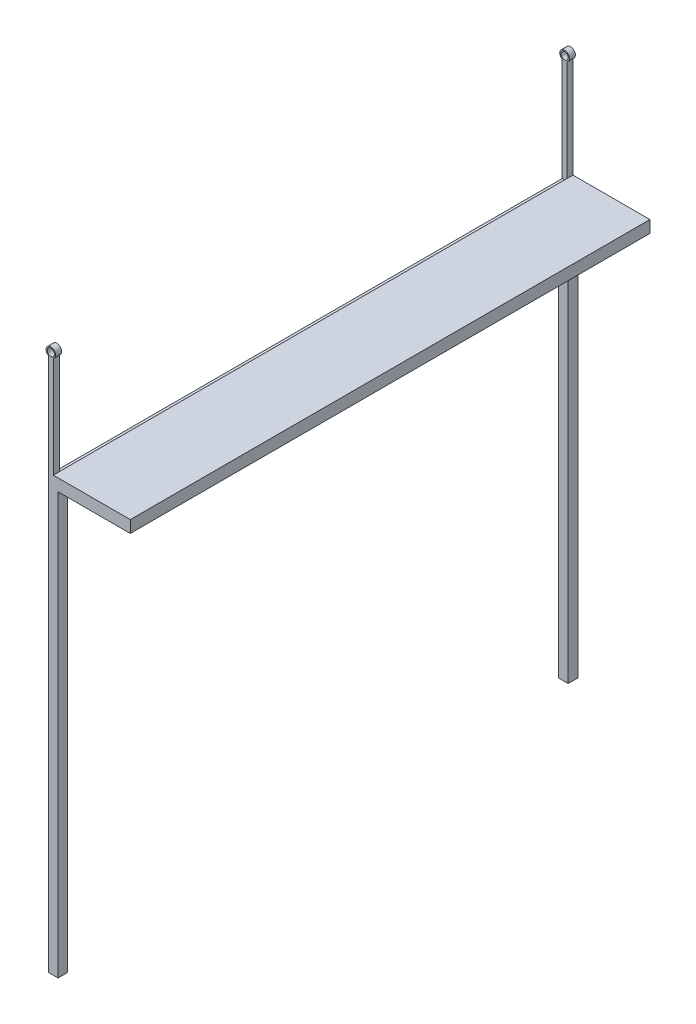
ISO-10303-21;
HEADER;
FILE_DESCRIPTION(('STEP AP214'),'2;1');
FILE_NAME('part.step','',(''),(''),'','','');
FILE_SCHEMA(('AUTOMOTIVE_DESIGN { 1 0 10303 214 1 1 1 1 }'));
ENDSEC;
DATA;
#1=APPLICATION_CONTEXT('core data for automotive mechanical design processes');
#2=APPLICATION_PROTOCOL_DEFINITION('international standard','automotive_design',2000,#1);
#3=PRODUCT_CONTEXT('',#1,'mechanical');
#4=PRODUCT('Part','Part','',(#3));
#5=PRODUCT_RELATED_PRODUCT_CATEGORY('part','',(#4));
#6=PRODUCT_DEFINITION_FORMATION('','',#4);
#7=PRODUCT_DEFINITION_CONTEXT('part definition',#1,'design');
#8=PRODUCT_DEFINITION('design','',#6,#7);
#9=PRODUCT_DEFINITION_SHAPE('','',#8);
#10=(LENGTH_UNIT() NAMED_UNIT(*) SI_UNIT(.MILLI.,.METRE.));
#11=(NAMED_UNIT(*) PLANE_ANGLE_UNIT() SI_UNIT($,.RADIAN.));
#12=(NAMED_UNIT(*) SI_UNIT($,.STERADIAN.) SOLID_ANGLE_UNIT());
#13=UNCERTAINTY_MEASURE_WITH_UNIT(LENGTH_MEASURE(1.E-05),#10,'distance_accuracy_value','');
#14=(GEOMETRIC_REPRESENTATION_CONTEXT(3) GLOBAL_UNCERTAINTY_ASSIGNED_CONTEXT((#13)) GLOBAL_UNIT_ASSIGNED_CONTEXT((#10,
#11,#12)) REPRESENTATION_CONTEXT('',''));
#15=CARTESIAN_POINT('',(0.,0.,0.));
#16=DIRECTION('',(0.,0.,1.));
#17=DIRECTION('',(1.,0.,0.));
#18=AXIS2_PLACEMENT_3D('',#15,#16,#17);
#19=CARTESIAN_POINT('',(0.,0.,0.));
#20=DIRECTION('',(0.,-1.,0.));
#21=DIRECTION('',(0.,0.,-1.));
#22=AXIS2_PLACEMENT_3D('',#19,#20,#21);
#23=PLANE('',#22);
#24=DIRECTION('',(-1.,0.,0.));
#25=VECTOR('',#24,1.);
#26=CARTESIAN_POINT('',(0.,0.,-1320.8));
#27=LINE('',#26,#25);
#28=CARTESIAN_POINT('',(50.8,0.,-1320.8));
#29=VERTEX_POINT('',#28);
#30=CARTESIAN_POINT('',(0.,0.,-1320.8));
#31=VERTEX_POINT('',#30);
#32=EDGE_CURVE('E182',#29,#31,#27,.T.);
#33=ORIENTED_EDGE('',*,*,#32,.F.);
#34=DIRECTION('',(0.,0.,1.));
#35=VECTOR('',#34,1.);
#36=CARTESIAN_POINT('',(50.8,0.,-1371.6));
#37=LINE('',#36,#35);
#38=CARTESIAN_POINT('',(50.8,0.,-1371.6));
#39=VERTEX_POINT('',#38);
#40=EDGE_CURVE('E184',#39,#29,#37,.T.);
#41=ORIENTED_EDGE('',*,*,#40,.F.);
#42=DIRECTION('',(-1.,0.,0.));
#43=VECTOR('',#42,1.);
#44=CARTESIAN_POINT('',(-25.4,0.,-1371.6));
#45=LINE('',#44,#43);
#46=CARTESIAN_POINT('',(431.8,0.,-1371.6));
#47=VERTEX_POINT('',#46);
#48=EDGE_CURVE('E294',#47,#39,#45,.T.);
#49=ORIENTED_EDGE('',*,*,#48,.F.);
#50=DIRECTION('',(0.,0.,-1.));
#51=VECTOR('',#50,1.);
#52=CARTESIAN_POINT('',(431.8,0.,1371.6));
#53=LINE('',#52,#51);
#54=CARTESIAN_POINT('',(431.8,0.,1371.6));
#55=VERTEX_POINT('',#54);
#56=EDGE_CURVE('E226',#55,#47,#53,.T.);
#57=ORIENTED_EDGE('',*,*,#56,.F.);
#58=DIRECTION('',(1.,0.,0.));
#59=VECTOR('',#58,1.);
#60=CARTESIAN_POINT('',(-25.4,0.,1371.6));
#61=LINE('',#60,#59);
#62=CARTESIAN_POINT('',(50.8,0.,1371.6));
#63=VERTEX_POINT('',#62);
#64=EDGE_CURVE('E59',#63,#55,#61,.T.);
#65=ORIENTED_EDGE('',*,*,#64,.F.);
#66=DIRECTION('',(0.,0.,1.));
#67=VECTOR('',#66,1.);
#68=CARTESIAN_POINT('',(50.8,0.,1371.6));
#69=LINE('',#68,#67);
#70=CARTESIAN_POINT('',(50.8,0.,1320.8));
#71=VERTEX_POINT('',#70);
#72=EDGE_CURVE('E200',#71,#63,#69,.T.);
#73=ORIENTED_EDGE('',*,*,#72,.F.);
#74=DIRECTION('',(1.,0.,0.));
#75=VECTOR('',#74,1.);
#76=CARTESIAN_POINT('',(0.,0.,1320.8));
#77=LINE('',#76,#75);
#78=CARTESIAN_POINT('',(0.,0.,1320.8));
#79=VERTEX_POINT('',#78);
#80=EDGE_CURVE('E195',#79,#71,#77,.T.);
#81=ORIENTED_EDGE('',*,*,#80,.F.);
#82=DIRECTION('',(0.,0.,1.));
#83=VECTOR('',#82,1.);
#84=CARTESIAN_POINT('',(0.,0.,-1371.6));
#85=LINE('',#84,#83);
#86=EDGE_CURVE('E220',#31,#79,#85,.T.);
#87=ORIENTED_EDGE('',*,*,#86,.F.);
#88=EDGE_LOOP('',(#33,#41,#49,#57,#65,#73,#81,#87));
#89=FACE_BOUND('',#88,.T.);
#90=ADVANCED_FACE('F36',(#89),#23,.T.);
#91=CARTESIAN_POINT('',(0.,50.8,0.));
#92=DIRECTION('',(0.,-1.,0.));
#93=DIRECTION('',(0.,0.,-1.));
#94=AXIS2_PLACEMENT_3D('',#91,#92,#93);
#95=PLANE('',#94);
#96=DIRECTION('',(-1.,0.,0.));
#97=VECTOR('',#96,1.);
#98=CARTESIAN_POINT('',(0.,50.8,-1339.85));
#99=LINE('',#98,#97);
#100=CARTESIAN_POINT('',(25.4,50.8,-1339.85));
#101=VERTEX_POINT('',#100);
#102=CARTESIAN_POINT('',(0.,50.8,-1339.85));
#103=VERTEX_POINT('',#102);
#104=EDGE_CURVE('E248',#101,#103,#99,.T.);
#105=ORIENTED_EDGE('',*,*,#104,.T.);
#106=DIRECTION('',(0.,0.,1.));
#107=VECTOR('',#106,1.);
#108=CARTESIAN_POINT('',(0.,50.8,-1371.6));
#109=LINE('',#108,#107);
#110=CARTESIAN_POINT('',(0.,50.8,1339.85));
#111=VERTEX_POINT('',#110);
#112=EDGE_CURVE('E219',#103,#111,#109,.T.);
#113=ORIENTED_EDGE('',*,*,#112,.T.);
#114=DIRECTION('',(-1.,0.,0.));
#115=VECTOR('',#114,1.);
#116=CARTESIAN_POINT('',(0.,50.8,1339.85));
#117=LINE('',#116,#115);
#118=CARTESIAN_POINT('',(25.4000000000003,50.8,1339.85));
#119=VERTEX_POINT('',#118);
#120=EDGE_CURVE('E278',#119,#111,#117,.T.);
#121=ORIENTED_EDGE('',*,*,#120,.F.);
#122=DIRECTION('',(0.,0.,1.));
#123=VECTOR('',#122,1.);
#124=CARTESIAN_POINT('',(25.4,50.8,-1371.6));
#125=LINE('',#124,#123);
#126=EDGE_CURVE('E235',#101,#119,#125,.T.);
#127=ORIENTED_EDGE('',*,*,#126,.F.);
#128=EDGE_LOOP('',(#105,#113,#121,#127));
#129=FACE_BOUND('',#128,.T.);
#130=ADVANCED_FACE('F331',(#129),#95,.F.);
#131=CARTESIAN_POINT('',(25.4,50.8,1371.6));
#132=DIRECTION('',(-1.,0.,0.));
#133=DIRECTION('',(0.,0.,1.));
#134=AXIS2_PLACEMENT_3D('',#131,#132,#133);
#135=PLANE('',#134);
#136=DIRECTION('',(0.,1.,0.));
#137=VECTOR('',#136,1.);
#138=CARTESIAN_POINT('',(25.4,0.,-1339.85));
#139=LINE('',#138,#137);
#140=CARTESIAN_POINT('',(25.4,63.5,-1339.85));
#141=VERTEX_POINT('',#140);
#142=CARTESIAN_POINT('',(25.4,596.9,-1339.85));
#143=VERTEX_POINT('',#142);
#144=EDGE_CURVE('E249',#141,#143,#139,.T.);
#145=ORIENTED_EDGE('',*,*,#144,.F.);
#146=DIRECTION('',(0.,0.,1.));
#147=VECTOR('',#146,1.);
#148=CARTESIAN_POINT('',(25.4,63.5,-1371.6));
#149=LINE('',#148,#147);
#150=CARTESIAN_POINT('',(25.4,63.5,-1371.6));
#151=VERTEX_POINT('',#150);
#152=EDGE_CURVE('E236',#151,#141,#149,.T.);
#153=ORIENTED_EDGE('',*,*,#152,.F.);
#154=DIRECTION('',(0.,-1.,0.));
#155=VECTOR('',#154,1.);
#156=CARTESIAN_POINT('',(25.4,50.8,-1371.6));
#157=LINE('',#156,#155);
#158=CARTESIAN_POINT('',(25.4,596.9,-1371.6));
#159=VERTEX_POINT('',#158);
#160=EDGE_CURVE('E11',#159,#151,#157,.T.);
#161=ORIENTED_EDGE('',*,*,#160,.F.);
#162=DIRECTION('',(0.,0.,-1.));
#163=VECTOR('',#162,1.);
#164=CARTESIAN_POINT('',(25.4,596.9,-1339.85));
#165=LINE('',#164,#163);
#166=EDGE_CURVE('E264',#143,#159,#165,.T.);
#167=ORIENTED_EDGE('',*,*,#166,.F.);
#168=EDGE_LOOP('',(#145,#153,#161,#167));
#169=FACE_BOUND('',#168,.T.);
#170=ADVANCED_FACE('F38',(#169),#135,.F.);
#171=DIRECTION('',(0.,-1.,0.));
#172=VECTOR('',#171,1.);
#173=CARTESIAN_POINT('',(25.4,50.8,1371.6));
#174=LINE('',#173,#172);
#175=CARTESIAN_POINT('',(25.4,596.9,1371.6));
#176=VERTEX_POINT('',#175);
#177=CARTESIAN_POINT('',(25.4000000000003,63.5,1371.6));
#178=VERTEX_POINT('',#177);
#179=EDGE_CURVE('E44',#176,#178,#174,.T.);
#180=ORIENTED_EDGE('',*,*,#179,.T.);
#181=CARTESIAN_POINT('',(25.4000000000003,63.5,1339.85));
#182=VERTEX_POINT('',#181);
#183=EDGE_CURVE('E241',#182,#178,#149,.T.);
#184=ORIENTED_EDGE('',*,*,#183,.F.);
#185=DIRECTION('',(0.,1.,0.));
#186=VECTOR('',#185,1.);
#187=CARTESIAN_POINT('',(25.4,0.,1339.85));
#188=LINE('',#187,#186);
#189=CARTESIAN_POINT('',(25.4,596.9,1339.85));
#190=VERTEX_POINT('',#189);
#191=EDGE_CURVE('E272',#182,#190,#188,.T.);
#192=ORIENTED_EDGE('',*,*,#191,.T.);
#193=DIRECTION('',(0.,0.,1.));
#194=VECTOR('',#193,1.);
#195=CARTESIAN_POINT('',(25.4,596.9,1339.85));
#196=LINE('',#195,#194);
#197=EDGE_CURVE('E284',#190,#176,#196,.T.);
#198=ORIENTED_EDGE('',*,*,#197,.T.);
#199=EDGE_LOOP('',(#180,#184,#192,#198));
#200=FACE_BOUND('',#199,.T.);
#201=ADVANCED_FACE('F301',(#200),#135,.F.);
#202=CARTESIAN_POINT('',(-25.4,50.8,-1371.6));
#203=DIRECTION('',(0.,0.,1.));
#204=DIRECTION('',(1.,0.,0.));
#205=AXIS2_PLACEMENT_3D('',#202,#203,#204);
#206=PLANE('',#205);
#207=ORIENTED_EDGE('',*,*,#48,.T.);
#208=DIRECTION('',(0.,1.,0.));
#209=VECTOR('',#208,1.);
#210=CARTESIAN_POINT('',(50.8,-2222.5,-1371.6));
#211=LINE('',#210,#209);
#212=CARTESIAN_POINT('',(50.8,-2222.5,-1371.6));
#213=VERTEX_POINT('',#212);
#214=EDGE_CURVE('E174',#213,#39,#211,.T.);
#215=ORIENTED_EDGE('',*,*,#214,.F.);
#216=DIRECTION('',(1.,0.,0.));
#217=VECTOR('',#216,1.);
#218=CARTESIAN_POINT('',(0.,-2222.5,-1371.6));
#219=LINE('',#218,#217);
#220=CARTESIAN_POINT('',(0.,-2222.5,-1371.6));
#221=VERTEX_POINT('',#220);
#222=EDGE_CURVE('E170',#221,#213,#219,.T.);
#223=ORIENTED_EDGE('',*,*,#222,.F.);
#224=DIRECTION('',(0.,-1.,0.));
#225=VECTOR('',#224,1.);
#226=CARTESIAN_POINT('',(0.,0.,-1371.6));
#227=LINE('',#226,#225);
#228=CARTESIAN_POINT('',(0.,596.9,-1371.6));
#229=VERTEX_POINT('',#228);
#230=EDGE_CURVE('E155',#229,#221,#227,.T.);
#231=ORIENTED_EDGE('',*,*,#230,.F.);
#232=CARTESIAN_POINT('',(12.7,618.897045256125,-1371.6));
#233=DIRECTION('',(0.,0.,1.));
#234=DIRECTION('',(1.,0.,0.));
#235=AXIS2_PLACEMENT_3D('',#232,#233,#234);
#236=CIRCLE('',#235,25.4);
#237=EDGE_CURVE('E166',#159,#229,#236,.T.);
#238=ORIENTED_EDGE('',*,*,#237,.F.);
#239=ORIENTED_EDGE('',*,*,#160,.T.);
#240=DIRECTION('',(-1.,0.,0.));
#241=VECTOR('',#240,1.);
#242=CARTESIAN_POINT('',(25.4,63.5,-1371.6));
#243=LINE('',#242,#241);
#244=CARTESIAN_POINT('',(431.8,63.5,-1371.6));
#245=VERTEX_POINT('',#244);
#246=EDGE_CURVE('E167',#245,#151,#243,.T.);
#247=ORIENTED_EDGE('',*,*,#246,.F.);
#248=DIRECTION('',(0.,1.,0.));
#249=VECTOR('',#248,1.);
#250=CARTESIAN_POINT('',(431.8,0.,-1371.6));
#251=LINE('',#250,#249);
#252=EDGE_CURVE('E229',#47,#245,#251,.T.);
#253=ORIENTED_EDGE('',*,*,#252,.F.);
#254=EDGE_LOOP('',(#207,#215,#223,#231,#238,#239,#247,#253));
#255=FACE_BOUND('',#254,.T.);
#256=CARTESIAN_POINT('',(12.7,618.897045256125,-1371.6));
#257=DIRECTION('',(0.,0.,1.));
#258=DIRECTION('',(1.,0.,0.));
#259=AXIS2_PLACEMENT_3D('',#256,#257,#258);
#260=CIRCLE('',#259,19.05);
#261=CARTESIAN_POINT('',(31.7499999999999,618.897045256125,-1371.6));
#262=VERTEX_POINT('',#261);
#263=EDGE_CURVE('E261',#262,#262,#260,.T.);
#264=ORIENTED_EDGE('',*,*,#263,.T.);
#265=EDGE_LOOP('',(#264));
#266=FACE_BOUND('',#265,.T.);
#267=ADVANCED_FACE('F172',(#255,#266),#206,.F.);
#268=CARTESIAN_POINT('',(-25.4,50.8,1371.6));
#269=DIRECTION('',(0.,0.,-1.));
#270=DIRECTION('',(-1.,0.,0.));
#271=AXIS2_PLACEMENT_3D('',#268,#269,#270);
#272=PLANE('',#271);
#273=DIRECTION('',(0.,-1.,0.));
#274=VECTOR('',#273,1.);
#275=CARTESIAN_POINT('',(0.,0.,1371.6));
#276=LINE('',#275,#274);
#277=CARTESIAN_POINT('',(0.,596.9,1371.6));
#278=VERTEX_POINT('',#277);
#279=CARTESIAN_POINT('',(0.,-2222.5,1371.6));
#280=VERTEX_POINT('',#279);
#281=EDGE_CURVE('E287',#278,#280,#276,.T.);
#282=ORIENTED_EDGE('',*,*,#281,.T.);
#283=DIRECTION('',(-1.,0.,0.));
#284=VECTOR('',#283,1.);
#285=CARTESIAN_POINT('',(0.,-2222.5,1371.6));
#286=LINE('',#285,#284);
#287=CARTESIAN_POINT('',(50.8,-2222.5,1371.6));
#288=VERTEX_POINT('',#287);
#289=EDGE_CURVE('E204',#288,#280,#286,.T.);
#290=ORIENTED_EDGE('',*,*,#289,.F.);
#291=DIRECTION('',(0.,1.,0.));
#292=VECTOR('',#291,1.);
#293=CARTESIAN_POINT('',(50.8,-2222.5,1371.6));
#294=LINE('',#293,#292);
#295=EDGE_CURVE('E207',#288,#63,#294,.T.);
#296=ORIENTED_EDGE('',*,*,#295,.T.);
#297=ORIENTED_EDGE('',*,*,#64,.T.);
#298=DIRECTION('',(0.,-1.,0.));
#299=VECTOR('',#298,1.);
#300=CARTESIAN_POINT('',(431.8,0.,1371.6));
#301=LINE('',#300,#299);
#302=CARTESIAN_POINT('',(431.8,63.5,1371.6));
#303=VERTEX_POINT('',#302);
#304=EDGE_CURVE('E222',#303,#55,#301,.T.);
#305=ORIENTED_EDGE('',*,*,#304,.F.);
#306=DIRECTION('',(1.,0.,0.));
#307=VECTOR('',#306,1.);
#308=CARTESIAN_POINT('',(25.4000000000003,63.5,1371.6));
#309=LINE('',#308,#307);
#310=EDGE_CURVE('E239',#178,#303,#309,.T.);
#311=ORIENTED_EDGE('',*,*,#310,.F.);
#312=ORIENTED_EDGE('',*,*,#179,.F.);
#313=CARTESIAN_POINT('',(12.7,618.897045256125,1371.6));
#314=DIRECTION('',(0.,0.,1.));
#315=DIRECTION('',(1.,0.,0.));
#316=AXIS2_PLACEMENT_3D('',#313,#314,#315);
#317=CIRCLE('',#316,25.4);
#318=EDGE_CURVE('E267',#176,#278,#317,.T.);
#319=ORIENTED_EDGE('',*,*,#318,.T.);
#320=EDGE_LOOP('',(#282,#290,#296,#297,#305,#311,#312,#319));
#321=FACE_BOUND('',#320,.T.);
#322=CARTESIAN_POINT('',(12.7,618.897045256125,1371.6));
#323=DIRECTION('',(0.,0.,1.));
#324=DIRECTION('',(1.,0.,0.));
#325=AXIS2_PLACEMENT_3D('',#322,#323,#324);
#326=CIRCLE('',#325,19.05);
#327=CARTESIAN_POINT('',(31.7499999999999,618.897045256125,1371.6));
#328=VERTEX_POINT('',#327);
#329=EDGE_CURVE('E289',#328,#328,#326,.T.);
#330=ORIENTED_EDGE('',*,*,#329,.F.);
#331=EDGE_LOOP('',(#330));
#332=FACE_BOUND('',#331,.T.);
#333=ADVANCED_FACE('F307',(#321,#332),#272,.F.);
#334=CARTESIAN_POINT('',(0.,0.,1339.85));
#335=DIRECTION('',(-1.,0.,0.));
#336=DIRECTION('',(0.,0.,1.));
#337=AXIS2_PLACEMENT_3D('',#334,#335,#336);
#338=PLANE('',#337);
#339=ORIENTED_EDGE('',*,*,#281,.F.);
#340=DIRECTION('',(0.,0.,1.));
#341=VECTOR('',#340,1.);
#342=CARTESIAN_POINT('',(0.,596.9,1339.85));
#343=LINE('',#342,#341);
#344=CARTESIAN_POINT('',(0.,596.9,1339.85));
#345=VERTEX_POINT('',#344);
#346=EDGE_CURVE('E292',#345,#278,#343,.T.);
#347=ORIENTED_EDGE('',*,*,#346,.F.);
#348=DIRECTION('',(0.,-1.,0.));
#349=VECTOR('',#348,1.);
#350=CARTESIAN_POINT('',(0.,0.,1339.85));
#351=LINE('',#350,#349);
#352=EDGE_CURVE('E275',#345,#111,#351,.T.);
#353=ORIENTED_EDGE('',*,*,#352,.T.);
#354=ORIENTED_EDGE('',*,*,#112,.F.);
#355=DIRECTION('',(0.,-1.,0.));
#356=VECTOR('',#355,1.);
#357=CARTESIAN_POINT('',(0.,0.,-1339.85));
#358=LINE('',#357,#356);
#359=CARTESIAN_POINT('',(0.,596.9,-1339.85));
#360=VERTEX_POINT('',#359);
#361=EDGE_CURVE('E252',#360,#103,#358,.T.);
#362=ORIENTED_EDGE('',*,*,#361,.F.);
#363=DIRECTION('',(0.,0.,-1.));
#364=VECTOR('',#363,1.);
#365=CARTESIAN_POINT('',(0.,596.9,-1339.85));
#366=LINE('',#365,#364);
#367=EDGE_CURVE('E163',#360,#229,#366,.T.);
#368=ORIENTED_EDGE('',*,*,#367,.T.);
#369=ORIENTED_EDGE('',*,*,#230,.T.);
#370=DIRECTION('',(0.,0.,-1.));
#371=VECTOR('',#370,1.);
#372=CARTESIAN_POINT('',(0.,-2222.5,-1371.6));
#373=LINE('',#372,#371);
#374=CARTESIAN_POINT('',(0.,-2222.5,-1320.8));
#375=VERTEX_POINT('',#374);
#376=EDGE_CURVE('E160',#375,#221,#373,.T.);
#377=ORIENTED_EDGE('',*,*,#376,.F.);
#378=DIRECTION('',(0.,1.,0.));
#379=VECTOR('',#378,1.);
#380=CARTESIAN_POINT('',(0.,-2222.5,-1320.8));
#381=LINE('',#380,#379);
#382=EDGE_CURVE('E51',#375,#31,#381,.T.);
#383=ORIENTED_EDGE('',*,*,#382,.T.);
#384=ORIENTED_EDGE('',*,*,#86,.T.);
#385=DIRECTION('',(0.,1.,0.));
#386=VECTOR('',#385,1.);
#387=CARTESIAN_POINT('',(0.,-2222.5,1320.8));
#388=LINE('',#387,#386);
#389=CARTESIAN_POINT('',(0.,-2222.5,1320.8));
#390=VERTEX_POINT('',#389);
#391=EDGE_CURVE('E216',#390,#79,#388,.T.);
#392=ORIENTED_EDGE('',*,*,#391,.F.);
#393=DIRECTION('',(0.,0.,-1.));
#394=VECTOR('',#393,1.);
#395=CARTESIAN_POINT('',(0.,-2222.5,1371.6));
#396=LINE('',#395,#394);
#397=EDGE_CURVE('E196',#280,#390,#396,.T.);
#398=ORIENTED_EDGE('',*,*,#397,.F.);
#399=EDGE_LOOP('',(#339,#347,#353,#354,#362,#368,#369,#377,#383,#384,#392,#398));
#400=FACE_BOUND('',#399,.T.);
#401=ADVANCED_FACE('F158',(#400),#338,.T.);
#402=CARTESIAN_POINT('',(12.7,618.897045256125,1339.85));
#403=DIRECTION('',(0.,0.,1.));
#404=DIRECTION('',(1.,0.,0.));
#405=AXIS2_PLACEMENT_3D('',#402,#403,#404);
#406=CYLINDRICAL_SURFACE('',#405,25.4);
#407=ORIENTED_EDGE('',*,*,#318,.F.);
#408=ORIENTED_EDGE('',*,*,#197,.F.);
#409=CARTESIAN_POINT('',(12.7,618.897045256125,1339.85));
#410=DIRECTION('',(0.,0.,1.));
#411=DIRECTION('',(1.,0.,0.));
#412=AXIS2_PLACEMENT_3D('',#409,#410,#411);
#413=CIRCLE('',#412,25.4);
#414=EDGE_CURVE('E271',#190,#345,#413,.T.);
#415=ORIENTED_EDGE('',*,*,#414,.T.);
#416=ORIENTED_EDGE('',*,*,#346,.T.);
#417=EDGE_LOOP('',(#407,#408,#415,#416));
#418=FACE_BOUND('',#417,.T.);
#419=ADVANCED_FACE('F339',(#418),#406,.T.);
#420=CARTESIAN_POINT('',(12.7,618.897045256125,1339.85));
#421=DIRECTION('',(0.,0.,1.));
#422=DIRECTION('',(1.,0.,0.));
#423=AXIS2_PLACEMENT_3D('',#420,#421,#422);
#424=CYLINDRICAL_SURFACE('',#423,19.05);
#425=CARTESIAN_POINT('',(12.7,618.897045256125,1339.85));
#426=DIRECTION('',(0.,0.,1.));
#427=DIRECTION('',(1.,0.,0.));
#428=AXIS2_PLACEMENT_3D('',#425,#426,#427);
#429=CIRCLE('',#428,19.05);
#430=CARTESIAN_POINT('',(31.7499999999999,618.897045256125,1339.85));
#431=VERTEX_POINT('',#430);
#432=EDGE_CURVE('E281',#431,#431,#429,.T.);
#433=ORIENTED_EDGE('',*,*,#432,.F.);
#434=EDGE_LOOP('',(#433));
#435=FACE_BOUND('',#434,.T.);
#436=ORIENTED_EDGE('',*,*,#329,.T.);
#437=EDGE_LOOP('',(#436));
#438=FACE_BOUND('',#437,.T.);
#439=ADVANCED_FACE('F408',(#435,#438),#424,.F.);
#440=CARTESIAN_POINT('',(0.,0.,1339.85));
#441=DIRECTION('',(0.,0.,1.));
#442=DIRECTION('',(1.,0.,0.));
#443=AXIS2_PLACEMENT_3D('',#440,#441,#442);
#444=PLANE('',#443);
#445=EDGE_CURVE('E269',#119,#182,#188,.T.);
#446=ORIENTED_EDGE('',*,*,#445,.F.);
#447=ORIENTED_EDGE('',*,*,#120,.T.);
#448=ORIENTED_EDGE('',*,*,#352,.F.);
#449=ORIENTED_EDGE('',*,*,#414,.F.);
#450=ORIENTED_EDGE('',*,*,#191,.F.);
#451=EDGE_LOOP('',(#446,#447,#448,#449,#450));
#452=FACE_BOUND('',#451,.T.);
#453=ORIENTED_EDGE('',*,*,#432,.T.);
#454=EDGE_LOOP('',(#453));
#455=FACE_BOUND('',#454,.T.);
#456=ADVANCED_FACE('F335',(#452,#455),#444,.F.);
#457=CARTESIAN_POINT('',(12.7,618.897045256125,-1339.85));
#458=DIRECTION('',(0.,0.,-1.));
#459=DIRECTION('',(-1.,0.,0.));
#460=AXIS2_PLACEMENT_3D('',#457,#458,#459);
#461=CYLINDRICAL_SURFACE('',#460,25.4);
#462=ORIENTED_EDGE('',*,*,#237,.T.);
#463=ORIENTED_EDGE('',*,*,#367,.F.);
#464=CARTESIAN_POINT('',(12.7,618.897045256125,-1339.85));
#465=DIRECTION('',(0.,0.,1.));
#466=DIRECTION('',(1.,0.,0.));
#467=AXIS2_PLACEMENT_3D('',#464,#465,#466);
#468=CIRCLE('',#467,25.4);
#469=EDGE_CURVE('E255',#143,#360,#468,.T.);
#470=ORIENTED_EDGE('',*,*,#469,.F.);
#471=ORIENTED_EDGE('',*,*,#166,.T.);
#472=EDGE_LOOP('',(#462,#463,#470,#471));
#473=FACE_BOUND('',#472,.T.);
#474=ADVANCED_FACE('F407',(#473),#461,.T.);
#475=CARTESIAN_POINT('',(12.7,618.897045256125,-1339.85));
#476=DIRECTION('',(0.,0.,-1.));
#477=DIRECTION('',(-1.,0.,0.));
#478=AXIS2_PLACEMENT_3D('',#475,#476,#477);
#479=CYLINDRICAL_SURFACE('',#478,19.05);
#480=CARTESIAN_POINT('',(12.7,618.897045256125,-1339.85));
#481=DIRECTION('',(0.,0.,1.));
#482=DIRECTION('',(1.,0.,0.));
#483=AXIS2_PLACEMENT_3D('',#480,#481,#482);
#484=CIRCLE('',#483,19.05);
#485=CARTESIAN_POINT('',(31.7499999999999,618.897045256125,-1339.85));
#486=VERTEX_POINT('',#485);
#487=EDGE_CURVE('E257',#486,#486,#484,.T.);
#488=ORIENTED_EDGE('',*,*,#487,.T.);
#489=EDGE_LOOP('',(#488));
#490=FACE_BOUND('',#489,.T.);
#491=ORIENTED_EDGE('',*,*,#263,.F.);
#492=EDGE_LOOP('',(#491));
#493=FACE_BOUND('',#492,.T.);
#494=ADVANCED_FACE('F420',(#490,#493),#479,.F.);
#495=CARTESIAN_POINT('',(0.,0.,-1339.85));
#496=DIRECTION('',(0.,0.,-1.));
#497=DIRECTION('',(1.,0.,0.));
#498=AXIS2_PLACEMENT_3D('',#495,#496,#497);
#499=PLANE('',#498);
#500=EDGE_CURVE('E245',#101,#141,#139,.T.);
#501=ORIENTED_EDGE('',*,*,#500,.T.);
#502=ORIENTED_EDGE('',*,*,#144,.T.);
#503=ORIENTED_EDGE('',*,*,#469,.T.);
#504=ORIENTED_EDGE('',*,*,#361,.T.);
#505=ORIENTED_EDGE('',*,*,#104,.F.);
#506=EDGE_LOOP('',(#501,#502,#503,#504,#505));
#507=FACE_BOUND('',#506,.T.);
#508=ORIENTED_EDGE('',*,*,#487,.F.);
#509=EDGE_LOOP('',(#508));
#510=FACE_BOUND('',#509,.T.);
#511=ADVANCED_FACE('F324',(#507,#510),#499,.F.);
#512=CARTESIAN_POINT('',(25.4,63.5,-1371.6));
#513=DIRECTION('',(1.,0.,0.));
#514=DIRECTION('',(0.,0.,-1.));
#515=AXIS2_PLACEMENT_3D('',#512,#513,#514);
#516=PLANE('',#515);
#517=ORIENTED_EDGE('',*,*,#126,.T.);
#518=ORIENTED_EDGE('',*,*,#445,.T.);
#519=EDGE_CURVE('E240',#141,#182,#149,.T.);
#520=ORIENTED_EDGE('',*,*,#519,.F.);
#521=ORIENTED_EDGE('',*,*,#500,.F.);
#522=EDGE_LOOP('',(#517,#518,#520,#521));
#523=FACE_BOUND('',#522,.T.);
#524=ADVANCED_FACE('F328',(#523),#516,.F.);
#525=CARTESIAN_POINT('',(0.,63.5,0.));
#526=DIRECTION('',(0.,1.,0.));
#527=DIRECTION('',(0.,0.,1.));
#528=AXIS2_PLACEMENT_3D('',#525,#526,#527);
#529=PLANE('',#528);
#530=ORIENTED_EDGE('',*,*,#152,.T.);
#531=ORIENTED_EDGE('',*,*,#519,.T.);
#532=ORIENTED_EDGE('',*,*,#183,.T.);
#533=ORIENTED_EDGE('',*,*,#310,.T.);
#534=DIRECTION('',(0.,0.,1.));
#535=VECTOR('',#534,1.);
#536=CARTESIAN_POINT('',(431.8,63.5,1371.6));
#537=LINE('',#536,#535);
#538=EDGE_CURVE('E232',#245,#303,#537,.T.);
#539=ORIENTED_EDGE('',*,*,#538,.F.);
#540=ORIENTED_EDGE('',*,*,#246,.T.);
#541=EDGE_LOOP('',(#530,#531,#532,#533,#539,#540));
#542=FACE_BOUND('',#541,.T.);
#543=ADVANCED_FACE('F312',(#542),#529,.T.);
#544=CARTESIAN_POINT('',(431.8,0.,0.));
#545=DIRECTION('',(-1.,0.,0.));
#546=DIRECTION('',(0.,0.,1.));
#547=AXIS2_PLACEMENT_3D('',#544,#545,#546);
#548=PLANE('',#547);
#549=ORIENTED_EDGE('',*,*,#304,.T.);
#550=ORIENTED_EDGE('',*,*,#56,.T.);
#551=ORIENTED_EDGE('',*,*,#252,.T.);
#552=ORIENTED_EDGE('',*,*,#538,.T.);
#553=EDGE_LOOP('',(#549,#550,#551,#552));
#554=FACE_BOUND('',#553,.T.);
#555=ADVANCED_FACE('F315',(#554),#548,.F.);
#556=CARTESIAN_POINT('',(0.,-2222.5,1320.8));
#557=DIRECTION('',(0.,0.,1.));
#558=DIRECTION('',(1.,0.,0.));
#559=AXIS2_PLACEMENT_3D('',#556,#557,#558);
#560=PLANE('',#559);
#561=ORIENTED_EDGE('',*,*,#80,.T.);
#562=DIRECTION('',(0.,1.,0.));
#563=VECTOR('',#562,1.);
#564=CARTESIAN_POINT('',(50.8,-2222.5,1320.8));
#565=LINE('',#564,#563);
#566=CARTESIAN_POINT('',(50.8,-2222.5,1320.8));
#567=VERTEX_POINT('',#566);
#568=EDGE_CURVE('E213',#567,#71,#565,.T.);
#569=ORIENTED_EDGE('',*,*,#568,.F.);
#570=DIRECTION('',(1.,0.,0.));
#571=VECTOR('',#570,1.);
#572=CARTESIAN_POINT('',(0.,-2222.5,1320.8));
#573=LINE('',#572,#571);
#574=EDGE_CURVE('E199',#390,#567,#573,.T.);
#575=ORIENTED_EDGE('',*,*,#574,.F.);
#576=ORIENTED_EDGE('',*,*,#391,.T.);
#577=EDGE_LOOP('',(#561,#569,#575,#576));
#578=FACE_BOUND('',#577,.T.);
#579=ADVANCED_FACE('F360',(#578),#560,.F.);
#580=CARTESIAN_POINT('',(50.8,-2222.5,1371.6));
#581=DIRECTION('',(-1.,0.,0.));
#582=DIRECTION('',(0.,0.,1.));
#583=AXIS2_PLACEMENT_3D('',#580,#581,#582);
#584=PLANE('',#583);
#585=ORIENTED_EDGE('',*,*,#72,.T.);
#586=ORIENTED_EDGE('',*,*,#295,.F.);
#587=DIRECTION('',(0.,0.,1.));
#588=VECTOR('',#587,1.);
#589=CARTESIAN_POINT('',(50.8,-2222.5,1371.6));
#590=LINE('',#589,#588);
#591=EDGE_CURVE('E202',#567,#288,#590,.T.);
#592=ORIENTED_EDGE('',*,*,#591,.F.);
#593=ORIENTED_EDGE('',*,*,#568,.T.);
#594=EDGE_LOOP('',(#585,#586,#592,#593));
#595=FACE_BOUND('',#594,.T.);
#596=ADVANCED_FACE('F349',(#595),#584,.F.);
#597=CARTESIAN_POINT('',(0.,-2222.5,0.));
#598=DIRECTION('',(0.,-1.,0.));
#599=DIRECTION('',(0.,0.,-1.));
#600=AXIS2_PLACEMENT_3D('',#597,#598,#599);
#601=PLANE('',#600);
#602=ORIENTED_EDGE('',*,*,#397,.T.);
#603=ORIENTED_EDGE('',*,*,#574,.T.);
#604=ORIENTED_EDGE('',*,*,#591,.T.);
#605=ORIENTED_EDGE('',*,*,#289,.T.);
#606=EDGE_LOOP('',(#602,#603,#604,#605));
#607=FACE_BOUND('',#606,.T.);
#608=ADVANCED_FACE('F344',(#607),#601,.T.);
#609=CARTESIAN_POINT('',(50.8,-2222.5,-1371.6));
#610=DIRECTION('',(-1.,0.,0.));
#611=DIRECTION('',(0.,0.,1.));
#612=AXIS2_PLACEMENT_3D('',#609,#610,#611);
#613=PLANE('',#612);
#614=ORIENTED_EDGE('',*,*,#40,.T.);
#615=DIRECTION('',(0.,1.,0.));
#616=VECTOR('',#615,1.);
#617=CARTESIAN_POINT('',(50.8,-2222.5,-1320.8));
#618=LINE('',#617,#616);
#619=CARTESIAN_POINT('',(50.8,-2222.5,-1320.8));
#620=VERTEX_POINT('',#619);
#621=EDGE_CURVE('E191',#620,#29,#618,.T.);
#622=ORIENTED_EDGE('',*,*,#621,.F.);
#623=DIRECTION('',(0.,0.,1.));
#624=VECTOR('',#623,1.);
#625=CARTESIAN_POINT('',(50.8,-2222.5,-1371.6));
#626=LINE('',#625,#624);
#627=EDGE_CURVE('E177',#213,#620,#626,.T.);
#628=ORIENTED_EDGE('',*,*,#627,.F.);
#629=ORIENTED_EDGE('',*,*,#214,.T.);
#630=EDGE_LOOP('',(#614,#622,#628,#629));
#631=FACE_BOUND('',#630,.T.);
#632=ADVANCED_FACE('F355',(#631),#613,.F.);
#633=CARTESIAN_POINT('',(0.,-2222.5,-1320.8));
#634=DIRECTION('',(0.,0.,-1.));
#635=DIRECTION('',(-1.,0.,0.));
#636=AXIS2_PLACEMENT_3D('',#633,#634,#635);
#637=PLANE('',#636);
#638=ORIENTED_EDGE('',*,*,#32,.T.);
#639=ORIENTED_EDGE('',*,*,#382,.F.);
#640=DIRECTION('',(-1.,0.,0.));
#641=VECTOR('',#640,1.);
#642=CARTESIAN_POINT('',(0.,-2222.5,-1320.8));
#643=LINE('',#642,#641);
#644=EDGE_CURVE('E181',#620,#375,#643,.T.);
#645=ORIENTED_EDGE('',*,*,#644,.F.);
#646=ORIENTED_EDGE('',*,*,#621,.T.);
#647=EDGE_LOOP('',(#638,#639,#645,#646));
#648=FACE_BOUND('',#647,.T.);
#649=ADVANCED_FACE('F357',(#648),#637,.F.);
#650=CARTESIAN_POINT('',(0.,-2222.5,0.));
#651=DIRECTION('',(0.,1.,0.));
#652=DIRECTION('',(0.,0.,1.));
#653=AXIS2_PLACEMENT_3D('',#650,#651,#652);
#654=PLANE('',#653);
#655=ORIENTED_EDGE('',*,*,#376,.T.);
#656=ORIENTED_EDGE('',*,*,#222,.T.);
#657=ORIENTED_EDGE('',*,*,#627,.T.);
#658=ORIENTED_EDGE('',*,*,#644,.T.);
#659=EDGE_LOOP('',(#655,#656,#657,#658));
#660=FACE_BOUND('',#659,.T.);
#661=ADVANCED_FACE('F179',(#660),#654,.F.);
#662=CLOSED_SHELL('',(#90,#130,#170,#201,#267,#333,#401,#419,#439,#456,#474,#494,#511,#524,#543,
#555,#579,#596,#608,#632,#649,#661));
#663=MANIFOLD_SOLID_BREP('B2',#662);
#664=ADVANCED_BREP_SHAPE_REPRESENTATION('',(#18,#663),#14);
#665=SHAPE_DEFINITION_REPRESENTATION(#9,#664);
ENDSEC;
END-ISO-10303-21;
